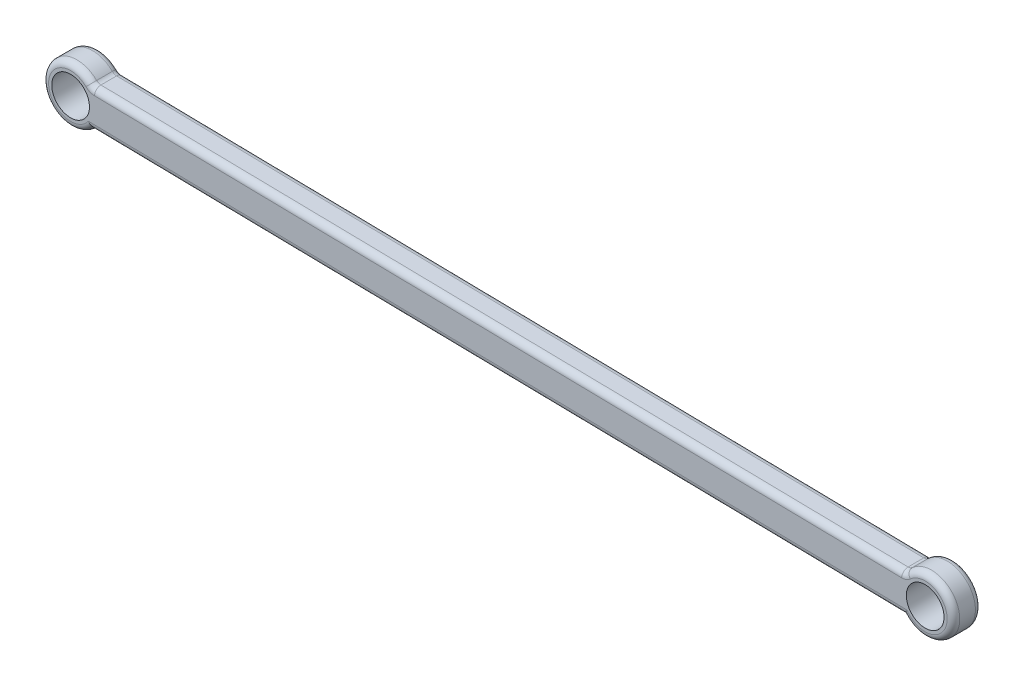
ISO-10303-21;
HEADER;
FILE_DESCRIPTION(('STEP AP214'),'2;1');
FILE_NAME('part.step','',(''),(''),'','','');
FILE_SCHEMA(('AUTOMOTIVE_DESIGN { 1 0 10303 214 1 1 1 1 }'));
ENDSEC;
DATA;
#1=APPLICATION_CONTEXT('core data for automotive mechanical design processes');
#2=APPLICATION_PROTOCOL_DEFINITION('international standard','automotive_design',2000,#1);
#3=PRODUCT_CONTEXT('',#1,'mechanical');
#4=PRODUCT('Part','Part','',(#3));
#5=PRODUCT_RELATED_PRODUCT_CATEGORY('part','',(#4));
#6=PRODUCT_DEFINITION_FORMATION('','',#4);
#7=PRODUCT_DEFINITION_CONTEXT('part definition',#1,'design');
#8=PRODUCT_DEFINITION('design','',#6,#7);
#9=PRODUCT_DEFINITION_SHAPE('','',#8);
#10=(LENGTH_UNIT() NAMED_UNIT(*) SI_UNIT(.MILLI.,.METRE.));
#11=(NAMED_UNIT(*) PLANE_ANGLE_UNIT() SI_UNIT($,.RADIAN.));
#12=(NAMED_UNIT(*) SI_UNIT($,.STERADIAN.) SOLID_ANGLE_UNIT());
#13=UNCERTAINTY_MEASURE_WITH_UNIT(LENGTH_MEASURE(1.E-05),#10,'distance_accuracy_value','');
#14=(GEOMETRIC_REPRESENTATION_CONTEXT(3) GLOBAL_UNCERTAINTY_ASSIGNED_CONTEXT((#13)) GLOBAL_UNIT_ASSIGNED_CONTEXT((#10,
#11,#12)) REPRESENTATION_CONTEXT('',''));
#15=CARTESIAN_POINT('',(0.,0.,0.));
#16=DIRECTION('',(0.,0.,1.));
#17=DIRECTION('',(1.,0.,0.));
#18=AXIS2_PLACEMENT_3D('',#15,#16,#17);
#19=CARTESIAN_POINT('',(0.,0.,0.));
#20=DIRECTION('',(0.,0.,1.));
#21=DIRECTION('',(1.,0.,0.));
#22=AXIS2_PLACEMENT_3D('',#19,#20,#21);
#23=PLANE('',#22);
#24=CARTESIAN_POINT('',(0.,0.,0.));
#25=DIRECTION('',(0.,0.,1.));
#26=DIRECTION('',(1.,0.,0.));
#27=AXIS2_PLACEMENT_3D('',#24,#25,#26);
#28=CIRCLE('',#27,3.);
#29=CARTESIAN_POINT('',(3.,0.,0.));
#30=VERTEX_POINT('',#29);
#31=EDGE_CURVE('E327',#30,#30,#28,.T.);
#32=ORIENTED_EDGE('',*,*,#31,.T.);
#33=EDGE_LOOP('',(#32));
#34=FACE_BOUND('',#33,.T.);
#35=CARTESIAN_POINT('',(135.979972583347,-2.33389293503487,0.));
#36=DIRECTION('',(0.,0.,1.));
#37=DIRECTION('',(1.,0.,0.));
#38=AXIS2_PLACEMENT_3D('',#35,#36,#37);
#39=CIRCLE('',#38,2.99999999999999);
#40=CARTESIAN_POINT('',(138.979972583347,-2.33389293503487,0.));
#41=VERTEX_POINT('',#40);
#42=EDGE_CURVE('E326',#41,#41,#39,.T.);
#43=ORIENTED_EDGE('',*,*,#42,.T.);
#44=EDGE_LOOP('',(#43));
#45=FACE_BOUND('',#44,.T.);
#46=CARTESIAN_POINT('',(3.84300523160737,3.93462968903535,0.));
#47=DIRECTION('',(0.,0.,1.));
#48=DIRECTION('',(1.,0.,0.));
#49=AXIS2_PLACEMENT_3D('',#46,#47,#48);
#50=CIRCLE('',#49,2.);
#51=CARTESIAN_POINT('',(3.80868327668039,1.93492420986848,0.));
#52=VERTEX_POINT('',#51);
#53=CARTESIAN_POINT('',(2.44554878375015,2.50385525665886,0.));
#54=VERTEX_POINT('',#53);
#55=EDGE_CURVE('E185',#52,#54,#50,.F.);
#56=ORIENTED_EDGE('',*,*,#55,.F.);
#57=DIRECTION('',(0.999852739583434,-0.0171609774634917,0.));
#58=VECTOR('',#57,1.);
#59=CARTESIAN_POINT('',(132.660686498477,-0.276627787614941,0.));
#60=LINE('',#59,#58);
#61=CARTESIAN_POINT('',(132.239933216521,-0.269406186569618,0.));
#62=VERTEX_POINT('',#61);
#63=EDGE_CURVE('E183',#52,#62,#60,.T.);
#64=ORIENTED_EDGE('',*,*,#63,.T.);
#65=CARTESIAN_POINT('',(132.274255171448,1.73029929259725,0.));
#66=DIRECTION('',(0.,0.,1.));
#67=DIRECTION('',(1.,0.,0.));
#68=AXIS2_PLACEMENT_3D('',#65,#66,#67);
#69=CIRCLE('',#68,2.);
#70=CARTESIAN_POINT('',(133.621788775775,0.252411209821921,0.));
#71=VERTEX_POINT('',#70);
#72=EDGE_CURVE('E180',#71,#62,#69,.F.);
#73=ORIENTED_EDGE('',*,*,#72,.F.);
#74=CARTESIAN_POINT('',(135.979972583347,-2.33389293503487,0.));
#75=DIRECTION('',(0.,0.,1.));
#76=DIRECTION('',(1.,0.,0.));
#77=AXIS2_PLACEMENT_3D('',#74,#75,#76);
#78=CIRCLE('',#77,3.5);
#79=CARTESIAN_POINT('',(133.073792278495,-4.28430725914431,0.));
#80=VERTEX_POINT('',#79);
#81=EDGE_CURVE('E177',#71,#80,#78,.F.);
#82=ORIENTED_EDGE('',*,*,#81,.T.);
#83=DIRECTION('',(0.999852739583434,-0.0171609774634917,0.));
#84=VECTOR('',#83,1.);
#85=CARTESIAN_POINT('',(-0.0343219549269834,-1.99970547916687,0.));
#86=LINE('',#85,#84);
#87=CARTESIAN_POINT('',(2.83753639499787,-2.04899663422429,0.));
#88=VERTEX_POINT('',#87);
#89=EDGE_CURVE('E173',#80,#88,#86,.F.);
#90=ORIENTED_EDGE('',*,*,#89,.T.);
#91=CARTESIAN_POINT('',(0.,0.,0.));
#92=DIRECTION('',(0.,0.,1.));
#93=DIRECTION('',(1.,0.,0.));
#94=AXIS2_PLACEMENT_3D('',#91,#92,#93);
#95=CIRCLE('',#94,3.5);
#96=EDGE_CURVE('E175',#88,#54,#95,.F.);
#97=ORIENTED_EDGE('',*,*,#96,.T.);
#98=EDGE_LOOP('',(#56,#64,#73,#82,#90,#97));
#99=FACE_BOUND('',#98,.T.);
#100=ADVANCED_FACE('F36',(#34,#45,#99),#23,.F.);
#101=CARTESIAN_POINT('',(0.,0.,4.5));
#102=DIRECTION('',(0.,0.,1.));
#103=DIRECTION('',(1.,0.,0.));
#104=AXIS2_PLACEMENT_3D('',#101,#102,#103);
#105=PLANE('',#104);
#106=CARTESIAN_POINT('',(0.,0.,4.5));
#107=DIRECTION('',(0.,0.,1.));
#108=DIRECTION('',(1.,0.,0.));
#109=AXIS2_PLACEMENT_3D('',#106,#107,#108);
#110=CIRCLE('',#109,3.);
#111=CARTESIAN_POINT('',(3.,0.,4.5));
#112=VERTEX_POINT('',#111);
#113=EDGE_CURVE('E332',#112,#112,#110,.T.);
#114=ORIENTED_EDGE('',*,*,#113,.F.);
#115=EDGE_LOOP('',(#114));
#116=FACE_BOUND('',#115,.T.);
#117=CARTESIAN_POINT('',(135.979972583347,-2.33389293503487,4.5));
#118=DIRECTION('',(0.,0.,1.));
#119=DIRECTION('',(1.,0.,0.));
#120=AXIS2_PLACEMENT_3D('',#117,#118,#119);
#121=CIRCLE('',#120,2.99999999999999);
#122=CARTESIAN_POINT('',(138.979972583347,-2.33389293503487,4.5));
#123=VERTEX_POINT('',#122);
#124=EDGE_CURVE('E323',#123,#123,#121,.T.);
#125=ORIENTED_EDGE('',*,*,#124,.F.);
#126=EDGE_LOOP('',(#125));
#127=FACE_BOUND('',#126,.T.);
#128=CARTESIAN_POINT('',(132.274255171448,1.73029929259725,4.5));
#129=DIRECTION('',(0.,0.,1.));
#130=DIRECTION('',(1.,0.,0.));
#131=AXIS2_PLACEMENT_3D('',#128,#129,#130);
#132=CIRCLE('',#131,2.);
#133=CARTESIAN_POINT('',(132.239933216521,-0.269406186569618,4.5));
#134=VERTEX_POINT('',#133);
#135=CARTESIAN_POINT('',(133.621788775775,0.252411209821921,4.5));
#136=VERTEX_POINT('',#135);
#137=EDGE_CURVE('E163',#134,#136,#132,.T.);
#138=ORIENTED_EDGE('',*,*,#137,.F.);
#139=DIRECTION('',(0.999852739583434,-0.0171609774634917,0.));
#140=VECTOR('',#139,1.);
#141=CARTESIAN_POINT('',(0.0343219549269834,1.99970547916687,4.5));
#142=LINE('',#141,#140);
#143=CARTESIAN_POINT('',(3.80868327668039,1.93492420986848,4.5));
#144=VERTEX_POINT('',#143);
#145=EDGE_CURVE('E161',#134,#144,#142,.F.);
#146=ORIENTED_EDGE('',*,*,#145,.T.);
#147=CARTESIAN_POINT('',(3.84300523160737,3.93462968903535,4.5));
#148=DIRECTION('',(0.,0.,1.));
#149=DIRECTION('',(1.,0.,0.));
#150=AXIS2_PLACEMENT_3D('',#147,#148,#149);
#151=CIRCLE('',#150,2.);
#152=CARTESIAN_POINT('',(2.44554878375015,2.50385525665886,4.5));
#153=VERTEX_POINT('',#152);
#154=EDGE_CURVE('E133',#153,#144,#151,.T.);
#155=ORIENTED_EDGE('',*,*,#154,.F.);
#156=CARTESIAN_POINT('',(0.,0.,4.5));
#157=DIRECTION('',(0.,0.,1.));
#158=DIRECTION('',(1.,0.,0.));
#159=AXIS2_PLACEMENT_3D('',#156,#157,#158);
#160=CIRCLE('',#159,3.5);
#161=CARTESIAN_POINT('',(2.83753639499787,-2.04899663422429,4.5));
#162=VERTEX_POINT('',#161);
#163=EDGE_CURVE('E125',#153,#162,#160,.T.);
#164=ORIENTED_EDGE('',*,*,#163,.T.);
#165=DIRECTION('',(0.999852739583434,-0.0171609774634917,0.));
#166=VECTOR('',#165,1.);
#167=CARTESIAN_POINT('',(132.592042588623,-4.27603874594867,4.5));
#168=LINE('',#167,#166);
#169=CARTESIAN_POINT('',(133.073792278495,-4.28430725914431,4.5));
#170=VERTEX_POINT('',#169);
#171=EDGE_CURVE('E130',#162,#170,#168,.T.);
#172=ORIENTED_EDGE('',*,*,#171,.T.);
#173=CARTESIAN_POINT('',(135.979972583347,-2.33389293503487,4.5));
#174=DIRECTION('',(0.,0.,1.));
#175=DIRECTION('',(1.,0.,0.));
#176=AXIS2_PLACEMENT_3D('',#173,#174,#175);
#177=CIRCLE('',#176,3.5);
#178=EDGE_CURVE('E137',#170,#136,#177,.T.);
#179=ORIENTED_EDGE('',*,*,#178,.T.);
#180=EDGE_LOOP('',(#138,#146,#155,#164,#172,#179));
#181=FACE_BOUND('',#180,.T.);
#182=ADVANCED_FACE('F127',(#116,#127,#181),#105,.T.);
#183=CARTESIAN_POINT('',(-0.0514829323904751,-2.9995582187503,4.5));
#184=DIRECTION('',(0.0171609774634917,0.999852739583434,0.));
#185=DIRECTION('',(-0.999852739583434,0.0171609774634917,0.));
#186=AXIS2_PLACEMENT_3D('',#183,#184,#185);
#187=PLANE('',#186);
#188=DIRECTION('',(0.,0.,-1.));
#189=VECTOR('',#188,1.);
#190=CARTESIAN_POINT('',(3.30212510740645,-3.05711788700336,4.5));
#191=LINE('',#190,#189);
#192=CARTESIAN_POINT('',(3.30212510740645,-3.05711788700336,3.5));
#193=VERTEX_POINT('',#192);
#194=CARTESIAN_POINT('',(3.30212510740645,-3.05711788700336,1.));
#195=VERTEX_POINT('',#194);
#196=EDGE_CURVE('E155',#193,#195,#191,.T.);
#197=ORIENTED_EDGE('',*,*,#196,.T.);
#198=DIRECTION('',(0.999852739583434,-0.0171609774634917,0.));
#199=VECTOR('',#198,1.);
#200=CARTESIAN_POINT('',(-0.0514829323904751,-2.9995582187503,1.));
#201=LINE('',#200,#199);
#202=CARTESIAN_POINT('',(132.57488161116,-5.27589148553211,1.));
#203=VERTEX_POINT('',#202);
#204=EDGE_CURVE('E11',#195,#203,#201,.T.);
#205=ORIENTED_EDGE('',*,*,#204,.T.);
#206=DIRECTION('',(0.,0.,-1.));
#207=VECTOR('',#206,1.);
#208=CARTESIAN_POINT('',(132.57488161116,-5.27589148553211,4.5));
#209=LINE('',#208,#207);
#210=CARTESIAN_POINT('',(132.57488161116,-5.27589148553211,3.5));
#211=VERTEX_POINT('',#210);
#212=EDGE_CURVE('E152',#211,#203,#209,.T.);
#213=ORIENTED_EDGE('',*,*,#212,.F.);
#214=DIRECTION('',(0.999852739583434,-0.0171609774634917,0.));
#215=VECTOR('',#214,1.);
#216=CARTESIAN_POINT('',(3.30212510740645,-3.05711788700336,3.5));
#217=LINE('',#216,#215);
#218=EDGE_CURVE('E45',#211,#193,#217,.F.);
#219=ORIENTED_EDGE('',*,*,#218,.T.);
#220=EDGE_LOOP('',(#197,#205,#213,#219));
#221=FACE_BOUND('',#220,.T.);
#222=ADVANCED_FACE('F293',(#221),#187,.F.);
#223=CARTESIAN_POINT('',(135.979972583347,-2.33389293503487,4.5));
#224=DIRECTION('',(0.,0.,-1.));
#225=DIRECTION('',(-1.,0.,0.));
#226=AXIS2_PLACEMENT_3D('',#223,#224,#225);
#227=CYLINDRICAL_SURFACE('',#226,4.5);
#228=DIRECTION('',(0.,0.,-1.));
#229=VECTOR('',#228,1.);
#230=CARTESIAN_POINT('',(132.948021973611,0.991355251209587,4.5));
#231=LINE('',#230,#229);
#232=CARTESIAN_POINT('',(132.948021973611,0.991355251209587,1.));
#233=VERTEX_POINT('',#232);
#234=CARTESIAN_POINT('',(132.948021973611,0.991355251209587,3.5));
#235=VERTEX_POINT('',#234);
#236=EDGE_CURVE('E166',#233,#235,#231,.F.);
#237=ORIENTED_EDGE('',*,*,#236,.T.);
#238=CARTESIAN_POINT('',(135.979972583347,-2.33389293503487,3.5));
#239=DIRECTION('',(0.,0.,1.));
#240=DIRECTION('',(1.,0.,0.));
#241=AXIS2_PLACEMENT_3D('',#238,#239,#240);
#242=CIRCLE('',#241,4.5);
#243=EDGE_CURVE('E170',#235,#211,#242,.F.);
#244=ORIENTED_EDGE('',*,*,#243,.T.);
#245=ORIENTED_EDGE('',*,*,#212,.T.);
#246=CARTESIAN_POINT('',(135.979972583347,-2.33389293503487,1.));
#247=DIRECTION('',(0.,0.,1.));
#248=DIRECTION('',(1.,0.,0.));
#249=AXIS2_PLACEMENT_3D('',#246,#247,#248);
#250=CIRCLE('',#249,4.5);
#251=EDGE_CURVE('E168',#203,#233,#250,.T.);
#252=ORIENTED_EDGE('',*,*,#251,.T.);
#253=EDGE_LOOP('',(#237,#244,#245,#252));
#254=FACE_BOUND('',#253,.T.);
#255=ADVANCED_FACE('F307',(#254),#227,.T.);
#256=CARTESIAN_POINT('',(0.0514829323904751,2.9995582187503,4.5));
#257=DIRECTION('',(0.0171609774634917,0.999852739583434,0.));
#258=DIRECTION('',(-0.999852739583434,0.0171609774634917,0.));
#259=AXIS2_PLACEMENT_3D('',#256,#257,#258);
#260=PLANE('',#259);
#261=DIRECTION('',(0.999852739583434,-0.0171609774634917,0.));
#262=VECTOR('',#261,1.);
#263=CARTESIAN_POINT('',(0.0514829323904751,2.9995582187503,3.5));
#264=LINE('',#263,#262);
#265=CARTESIAN_POINT('',(3.82584425414388,2.93477694945191,3.5));
#266=VERTEX_POINT('',#265);
#267=CARTESIAN_POINT('',(132.257094193984,0.730446553013816,3.5));
#268=VERTEX_POINT('',#267);
#269=EDGE_CURVE('E53',#266,#268,#264,.T.);
#270=ORIENTED_EDGE('',*,*,#269,.T.);
#271=DIRECTION('',(0.,0.,-1.));
#272=VECTOR('',#271,1.);
#273=CARTESIAN_POINT('',(132.257094193984,0.730446553013816,4.5));
#274=LINE('',#273,#272);
#275=CARTESIAN_POINT('',(132.257094193984,0.730446553013816,1.));
#276=VERTEX_POINT('',#275);
#277=EDGE_CURVE('E197',#268,#276,#274,.T.);
#278=ORIENTED_EDGE('',*,*,#277,.T.);
#279=DIRECTION('',(0.999852739583434,-0.0171609774634917,0.));
#280=VECTOR('',#279,1.);
#281=CARTESIAN_POINT('',(3.4050909721874,2.94199855049724,1.));
#282=LINE('',#281,#280);
#283=CARTESIAN_POINT('',(3.82584425414388,2.93477694945191,1.));
#284=VERTEX_POINT('',#283);
#285=EDGE_CURVE('E193',#276,#284,#282,.F.);
#286=ORIENTED_EDGE('',*,*,#285,.T.);
#287=DIRECTION('',(0.,0.,-1.));
#288=VECTOR('',#287,1.);
#289=CARTESIAN_POINT('',(3.82584425414388,2.93477694945191,4.5));
#290=LINE('',#289,#288);
#291=EDGE_CURVE('E58',#284,#266,#290,.F.);
#292=ORIENTED_EDGE('',*,*,#291,.T.);
#293=EDGE_LOOP('',(#270,#278,#286,#292));
#294=FACE_BOUND('',#293,.T.);
#295=ADVANCED_FACE('F303',(#294),#260,.T.);
#296=CARTESIAN_POINT('',(0.,0.,4.5));
#297=DIRECTION('',(0.,0.,-1.));
#298=DIRECTION('',(-1.,0.,0.));
#299=AXIS2_PLACEMENT_3D('',#296,#297,#298);
#300=CYLINDRICAL_SURFACE('',#299,3.);
#301=ORIENTED_EDGE('',*,*,#113,.T.);
#302=EDGE_LOOP('',(#301));
#303=FACE_BOUND('',#302,.T.);
#304=ORIENTED_EDGE('',*,*,#31,.F.);
#305=EDGE_LOOP('',(#304));
#306=FACE_BOUND('',#305,.T.);
#307=ADVANCED_FACE('F306',(#303,#306),#300,.F.);
#308=CARTESIAN_POINT('',(135.979972583347,-2.33389293503487,4.5));
#309=DIRECTION('',(0.,0.,-1.));
#310=DIRECTION('',(-1.,0.,0.));
#311=AXIS2_PLACEMENT_3D('',#308,#309,#310);
#312=CYLINDRICAL_SURFACE('',#311,2.99999999999999);
#313=ORIENTED_EDGE('',*,*,#124,.T.);
#314=EDGE_LOOP('',(#313));
#315=FACE_BOUND('',#314,.T.);
#316=ORIENTED_EDGE('',*,*,#42,.F.);
#317=EDGE_LOOP('',(#316));
#318=FACE_BOUND('',#317,.T.);
#319=ADVANCED_FACE('F301',(#315,#318),#312,.F.);
#320=CARTESIAN_POINT('',(0.,0.,4.5));
#321=DIRECTION('',(0.,0.,-1.));
#322=DIRECTION('',(-1.,0.,0.));
#323=AXIS2_PLACEMENT_3D('',#320,#321,#322);
#324=CYLINDRICAL_SURFACE('',#323,4.5);
#325=ORIENTED_EDGE('',*,*,#196,.F.);
#326=CARTESIAN_POINT('',(0.,0.,3.5));
#327=DIRECTION('',(0.,0.,1.));
#328=DIRECTION('',(1.,0.,0.));
#329=AXIS2_PLACEMENT_3D('',#326,#327,#328);
#330=CIRCLE('',#329,4.5);
#331=CARTESIAN_POINT('',(3.14427700767876,3.2192424728471,3.5));
#332=VERTEX_POINT('',#331);
#333=EDGE_CURVE('E143',#193,#332,#330,.F.);
#334=ORIENTED_EDGE('',*,*,#333,.T.);
#335=DIRECTION('',(0.,0.,-1.));
#336=VECTOR('',#335,1.);
#337=CARTESIAN_POINT('',(3.14427700767876,3.2192424728471,4.5));
#338=LINE('',#337,#336);
#339=CARTESIAN_POINT('',(3.14427700767876,3.2192424728471,1.));
#340=VERTEX_POINT('',#339);
#341=EDGE_CURVE('E188',#332,#340,#338,.T.);
#342=ORIENTED_EDGE('',*,*,#341,.T.);
#343=CARTESIAN_POINT('',(0.,0.,1.));
#344=DIRECTION('',(0.,0.,1.));
#345=DIRECTION('',(1.,0.,0.));
#346=AXIS2_PLACEMENT_3D('',#343,#344,#345);
#347=CIRCLE('',#346,4.5);
#348=EDGE_CURVE('E190',#340,#195,#347,.T.);
#349=ORIENTED_EDGE('',*,*,#348,.T.);
#350=EDGE_LOOP('',(#325,#334,#342,#349));
#351=FACE_BOUND('',#350,.T.);
#352=ADVANCED_FACE('F275',(#351),#324,.T.);
#353=CARTESIAN_POINT('',(0.,0.,1.));
#354=DIRECTION('',(0.,0.,1.));
#355=DIRECTION('',(1.,0.,0.));
#356=AXIS2_PLACEMENT_3D('',#353,#354,#355);
#357=TOROIDAL_SURFACE('',#356,3.5,1.);
#358=CARTESIAN_POINT('',(2.44554878375015,2.50385525665886,1.));
#359=DIRECTION('',(0.715387216188245,-0.698728223928613,0.));
#360=DIRECTION('',(0.698728223928613,0.715387216188245,0.));
#361=AXIS2_PLACEMENT_3D('',#358,#359,#360);
#362=CIRCLE('',#361,1.);
#363=EDGE_CURVE('E40',#54,#340,#362,.T.);
#364=ORIENTED_EDGE('',*,*,#363,.F.);
#365=ORIENTED_EDGE('',*,*,#96,.F.);
#366=CARTESIAN_POINT('',(3.30212510740645,-3.05711788700336,1.));
#367=CARTESIAN_POINT('',(3.30212521157756,-3.05711885999082,0.97369098490513));
#368=CARTESIAN_POINT('',(3.30167838618239,-3.05607106920634,0.94739518986789));
#369=CARTESIAN_POINT('',(3.29989710890886,-3.05189875249214,0.895004564383917));
#370=CARTESIAN_POINT('',(3.29856284161664,-3.04877465842942,0.868909693286948));
#371=CARTESIAN_POINT('',(3.29325125856682,-3.0363495891277,0.791366107169315));
#372=CARTESIAN_POINT('',(3.28796504552772,-3.02399546763632,0.740458545465482));
#373=CARTESIAN_POINT('',(3.27407319459768,-2.99166496737962,0.641663046184638));
#374=CARTESIAN_POINT('',(3.26546852490816,-2.97169081187325,0.593774232587049));
#375=CARTESIAN_POINT('',(3.24519847405663,-2.92490584486608,0.502152826212401));
#376=CARTESIAN_POINT('',(3.23353187051052,-2.89809230306849,0.458421902866517));
#377=CARTESIAN_POINT('',(3.2070372870186,-2.83763133304747,0.374752658797062));
#378=CARTESIAN_POINT('',(3.19211914646959,-2.8037906788811,0.334983067917316));
#379=CARTESIAN_POINT('',(3.15975010332598,-2.731001518731,0.261645150064272));
#380=CARTESIAN_POINT('',(3.14229850400742,-2.69205160794069,0.228078534755707));
#381=CARTESIAN_POINT('',(3.10373998606094,-2.6068442228663,0.165151698384092));
#382=CARTESIAN_POINT('',(3.08245079715035,-2.56024956871209,0.136360623747813));
#383=CARTESIAN_POINT('',(3.03785182167322,-2.46380524603787,0.0869139036327585));
#384=CARTESIAN_POINT('',(3.01454074282351,-2.41395350085728,0.0662635086864707));
#385=CARTESIAN_POINT('',(2.96667554118471,-2.31292208958825,0.0334198829886458));
#386=CARTESIAN_POINT('',(2.94213941234964,-2.26176514636932,0.0211293768558328));
#387=CARTESIAN_POINT('',(2.89204507406303,-2.15875214580948,0.00459543830027396));
#388=CARTESIAN_POINT('',(2.86648894561666,-2.10689764196446,0.000336399113860563));
#389=CARTESIAN_POINT('',(2.83961930142509,-2.05315879062629,6.36962392184466E-06));
#390=CARTESIAN_POINT('',(2.83857806109978,-2.0510775328194,-1.35553738185482E-08));
#391=CARTESIAN_POINT('',(2.83753639499787,-2.04899663422429,0.));
#392=B_SPLINE_CURVE_WITH_KNOTS('',3,(#366,#367,#368,#369,#370,#371,#372,#373,#374,#375,#376,
#377,#378,#379,#380,#381,#382,#383,#384,#385,#386,#387,#388,#389,#390,#391),.UNSPECIFIED.,.F.,
.F.,(4,2,2,2,2,2,2,2,2,2,2,2,4),(0.,0.0788764496467869,0.157736498278996,0.314864929107357,
0.471947550383108,0.629092977767609,0.791328554360695,0.953608832017077,1.12917135093585,
1.30484691869941,1.47844166216896,1.65169872695729,1.65868028216447),.UNSPECIFIED.);
#393=EDGE_CURVE('E263',#195,#88,#392,.T.);
#394=ORIENTED_EDGE('',*,*,#393,.F.);
#395=ORIENTED_EDGE('',*,*,#348,.F.);
#396=EDGE_LOOP('',(#364,#365,#394,#395));
#397=FACE_BOUND('',#396,.T.);
#398=ADVANCED_FACE('F271',(#397),#357,.T.);
#399=CARTESIAN_POINT('',(3.84300523160737,3.93462968903535,1.));
#400=DIRECTION('',(0.,0.,1.));
#401=DIRECTION('',(1.,0.,0.));
#402=AXIS2_PLACEMENT_3D('',#399,#400,#401);
#403=TOROIDAL_SURFACE('',#402,2.,1.);
#404=ORIENTED_EDGE('',*,*,#55,.T.);
#405=ORIENTED_EDGE('',*,*,#363,.T.);
#406=CARTESIAN_POINT('',(3.84300523160737,3.93462968903535,1.));
#407=DIRECTION('',(0.,0.,1.));
#408=DIRECTION('',(1.,0.,0.));
#409=AXIS2_PLACEMENT_3D('',#406,#407,#408);
#410=CIRCLE('',#409,1.);
#411=EDGE_CURVE('E270',#284,#340,#410,.F.);
#412=ORIENTED_EDGE('',*,*,#411,.F.);
#413=CARTESIAN_POINT('',(3.80868327668039,1.93492420986848,1.));
#414=DIRECTION('',(-0.999852739583434,0.0171609774634917,0.));
#415=DIRECTION('',(-0.0171609774634917,-0.999852739583434,0.));
#416=AXIS2_PLACEMENT_3D('',#413,#414,#415);
#417=CIRCLE('',#416,1.);
#418=EDGE_CURVE('E351',#52,#284,#417,.F.);
#419=ORIENTED_EDGE('',*,*,#418,.F.);
#420=EDGE_LOOP('',(#404,#405,#412,#419));
#421=FACE_BOUND('',#420,.T.);
#422=ADVANCED_FACE('F38',(#421),#403,.T.);
#423=CARTESIAN_POINT('',(-0.0343219549269834,-1.99970547916687,1.));
#424=DIRECTION('',(0.999852739583434,-0.0171609774634917,0.));
#425=DIRECTION('',(0.0171609774634917,0.999852739583434,0.));
#426=AXIS2_PLACEMENT_3D('',#423,#424,#425);
#427=CYLINDRICAL_SURFACE('',#426,1.);
#428=ORIENTED_EDGE('',*,*,#393,.T.);
#429=ORIENTED_EDGE('',*,*,#89,.F.);
#430=CARTESIAN_POINT('',(132.57488161116,-5.27589148553211,1.));
#431=CARTESIAN_POINT('',(132.57488147366,-5.27589245437165,0.973690984905129));
#432=CARTESIAN_POINT('',(132.575363992808,-5.27486061439685,0.947395189867889));
#433=CARTESIAN_POINT('',(132.57728740189,-5.27075188308533,0.895004564383915));
#434=CARTESIAN_POINT('',(132.578728092527,-5.26767541702681,0.868909693286946));
#435=CARTESIAN_POINT('',(132.584462936932,-5.25543994313759,0.791366107169313));
#436=CARTESIAN_POINT('',(132.590169991561,-5.24327450465045,0.740458545465481));
#437=CARTESIAN_POINT('',(132.60516314278,-5.21143977227165,0.641663046184636));
#438=CARTESIAN_POINT('',(132.614448195444,-5.19177266710378,0.593774232587046));
#439=CARTESIAN_POINT('',(132.636311822336,-5.14571086168388,0.502152826212397));
#440=CARTESIAN_POINT('',(132.648891711923,-5.11931347469165,0.458421902866515));
#441=CARTESIAN_POINT('',(132.677445523252,-5.05979732806865,0.37475265879706));
#442=CARTESIAN_POINT('',(132.693516183409,-5.02648855033716,0.334983067917312));
#443=CARTESIAN_POINT('',(132.72836405962,-4.95485306811635,0.261645150064267));
#444=CARTESIAN_POINT('',(132.747142020195,-4.91652498355728,0.228078534755705));
#445=CARTESIAN_POINT('',(132.78860188061,-4.83269099431746,0.165151698384092));
#446=CARTESIAN_POINT('',(132.811477514342,-4.78685436331611,0.136360623747812));
#447=CARTESIAN_POINT('',(132.859359891339,-4.69199734479457,0.0869139036327576));
#448=CARTESIAN_POINT('',(132.884367997391,-4.64297492618408,0.0662635086864702));
#449=CARTESIAN_POINT('',(132.935672091411,-4.54364560761384,0.0334198829886483));
#450=CARTESIAN_POINT('',(132.961949316247,-4.49336079964313,0.0211293768558368));
#451=CARTESIAN_POINT('',(133.015549235961,-4.39212755599563,0.00459543830027741));
#452=CARTESIAN_POINT('',(133.042869797748,-4.34118060148608,0.000336399113862785));
#453=CARTESIAN_POINT('',(133.071567766588,-4.28839548515035,6.36962392197958E-06));
#454=CARTESIAN_POINT('',(133.072679815942,-4.28635118534157,-1.35553737645666E-08));
#455=CARTESIAN_POINT('',(133.073792278495,-4.28430725914433,0.));
#456=B_SPLINE_CURVE_WITH_KNOTS('',3,(#430,#431,#432,#433,#434,#435,#436,#437,#438,#439,#440,
#441,#442,#443,#444,#445,#446,#447,#448,#449,#450,#451,#452,#453,#454,#455),.UNSPECIFIED.,.F.,
.F.,(4,2,2,2,2,2,2,2,2,2,2,2,4),(0.,0.0788764496467885,0.157736498278998,0.314864929107358,
0.471947550383107,0.629092977767616,0.7913285543607,0.953608832017076,1.12917135093586,
1.30484691869941,1.47844166216893,1.65169872695724,1.65868028216443),.UNSPECIFIED.);
#457=EDGE_CURVE('E256',#203,#80,#456,.T.);
#458=ORIENTED_EDGE('',*,*,#457,.F.);
#459=ORIENTED_EDGE('',*,*,#204,.F.);
#460=EDGE_LOOP('',(#428,#429,#458,#459));
#461=FACE_BOUND('',#460,.T.);
#462=ADVANCED_FACE('F246',(#461),#427,.T.);
#463=CARTESIAN_POINT('',(3.84300523160737,3.93462968903535,4.5));
#464=DIRECTION('',(0.,0.,-1.));
#465=DIRECTION('',(-1.,0.,0.));
#466=AXIS2_PLACEMENT_3D('',#463,#464,#465);
#467=CYLINDRICAL_SURFACE('',#466,1.);
#468=ORIENTED_EDGE('',*,*,#411,.T.);
#469=ORIENTED_EDGE('',*,*,#341,.F.);
#470=CARTESIAN_POINT('',(3.84300523160737,3.93462968903535,3.5));
#471=DIRECTION('',(0.,0.,1.));
#472=DIRECTION('',(1.,0.,0.));
#473=AXIS2_PLACEMENT_3D('',#470,#471,#472);
#474=CIRCLE('',#473,1.);
#475=EDGE_CURVE('E352',#266,#332,#474,.F.);
#476=ORIENTED_EDGE('',*,*,#475,.F.);
#477=ORIENTED_EDGE('',*,*,#291,.F.);
#478=EDGE_LOOP('',(#468,#469,#476,#477));
#479=FACE_BOUND('',#478,.T.);
#480=ADVANCED_FACE('F250',(#479),#467,.F.);
#481=CARTESIAN_POINT('',(0.0343219549269834,1.99970547916687,1.));
#482=DIRECTION('',(-0.999852739583434,0.0171609774634917,0.));
#483=DIRECTION('',(-0.0171609774634917,-0.999852739583434,0.));
#484=AXIS2_PLACEMENT_3D('',#481,#482,#483);
#485=CYLINDRICAL_SURFACE('',#484,1.);
#486=ORIENTED_EDGE('',*,*,#418,.T.);
#487=ORIENTED_EDGE('',*,*,#285,.F.);
#488=CARTESIAN_POINT('',(132.239933216521,-0.269406186569618,1.));
#489=DIRECTION('',(0.999852739583434,-0.0171609774634873,0.));
#490=DIRECTION('',(0.0171609774634873,0.999852739583434,0.));
#491=AXIS2_PLACEMENT_3D('',#488,#489,#490);
#492=CIRCLE('',#491,1.);
#493=EDGE_CURVE('E375',#62,#276,#492,.T.);
#494=ORIENTED_EDGE('',*,*,#493,.F.);
#495=ORIENTED_EDGE('',*,*,#63,.F.);
#496=EDGE_LOOP('',(#486,#487,#494,#495));
#497=FACE_BOUND('',#496,.T.);
#498=ADVANCED_FACE('F278',(#497),#485,.T.);
#499=CARTESIAN_POINT('',(135.979972583347,-2.33389293503487,1.));
#500=DIRECTION('',(0.,0.,1.));
#501=DIRECTION('',(1.,0.,0.));
#502=AXIS2_PLACEMENT_3D('',#499,#500,#501);
#503=TOROIDAL_SURFACE('',#502,3.5,1.);
#504=ORIENTED_EDGE('',*,*,#457,.T.);
#505=ORIENTED_EDGE('',*,*,#81,.F.);
#506=CARTESIAN_POINT('',(133.621788775775,0.252411209821927,1.));
#507=DIRECTION('',(-0.738944041387664,-0.673766802163528,0.));
#508=DIRECTION('',(0.673766802163528,-0.738944041387664,0.));
#509=AXIS2_PLACEMENT_3D('',#506,#507,#508);
#510=CIRCLE('',#509,1.);
#511=EDGE_CURVE('E355',#233,#71,#510,.T.);
#512=ORIENTED_EDGE('',*,*,#511,.F.);
#513=ORIENTED_EDGE('',*,*,#251,.F.);
#514=EDGE_LOOP('',(#504,#505,#512,#513));
#515=FACE_BOUND('',#514,.T.);
#516=ADVANCED_FACE('F244',(#515),#503,.T.);
#517=CARTESIAN_POINT('',(3.84300523160737,3.93462968903535,3.5));
#518=DIRECTION('',(0.,0.,1.));
#519=DIRECTION('',(1.,0.,0.));
#520=AXIS2_PLACEMENT_3D('',#517,#518,#519);
#521=TOROIDAL_SURFACE('',#520,2.,1.);
#522=CARTESIAN_POINT('',(3.80868327668039,1.93492420986848,3.5));
#523=DIRECTION('',(-0.999852739583434,0.0171609774634917,0.));
#524=DIRECTION('',(-0.0171609774634917,-0.999852739583434,0.));
#525=AXIS2_PLACEMENT_3D('',#522,#523,#524);
#526=CIRCLE('',#525,1.);
#527=EDGE_CURVE('E369',#266,#144,#526,.F.);
#528=ORIENTED_EDGE('',*,*,#527,.F.);
#529=ORIENTED_EDGE('',*,*,#475,.T.);
#530=CARTESIAN_POINT('',(2.44554878375015,2.50385525665886,3.5));
#531=DIRECTION('',(0.715387216188245,-0.698728223928613,0.));
#532=DIRECTION('',(0.698728223928613,0.715387216188245,0.));
#533=AXIS2_PLACEMENT_3D('',#530,#531,#532);
#534=CIRCLE('',#533,1.);
#535=EDGE_CURVE('E371',#153,#332,#534,.F.);
#536=ORIENTED_EDGE('',*,*,#535,.F.);
#537=ORIENTED_EDGE('',*,*,#154,.T.);
#538=EDGE_LOOP('',(#528,#529,#536,#537));
#539=FACE_BOUND('',#538,.T.);
#540=ADVANCED_FACE('F240',(#539),#521,.T.);
#541=CARTESIAN_POINT('',(132.274255171448,1.73029929259725,1.));
#542=DIRECTION('',(0.,0.,1.));
#543=DIRECTION('',(1.,0.,0.));
#544=AXIS2_PLACEMENT_3D('',#541,#542,#543);
#545=TOROIDAL_SURFACE('',#544,2.,1.);
#546=ORIENTED_EDGE('',*,*,#72,.T.);
#547=ORIENTED_EDGE('',*,*,#493,.T.);
#548=CARTESIAN_POINT('',(132.274255171448,1.73029929259725,1.));
#549=DIRECTION('',(0.,0.,1.));
#550=DIRECTION('',(1.,0.,0.));
#551=AXIS2_PLACEMENT_3D('',#548,#549,#550);
#552=CIRCLE('',#551,1.);
#553=EDGE_CURVE('E146',#233,#276,#552,.F.);
#554=ORIENTED_EDGE('',*,*,#553,.F.);
#555=ORIENTED_EDGE('',*,*,#511,.T.);
#556=EDGE_LOOP('',(#546,#547,#554,#555));
#557=FACE_BOUND('',#556,.T.);
#558=ADVANCED_FACE('F231',(#557),#545,.T.);
#559=CARTESIAN_POINT('',(0.,0.,3.5));
#560=DIRECTION('',(0.,0.,1.));
#561=DIRECTION('',(1.,0.,0.));
#562=AXIS2_PLACEMENT_3D('',#559,#560,#561);
#563=TOROIDAL_SURFACE('',#562,3.5,1.);
#564=ORIENTED_EDGE('',*,*,#535,.T.);
#565=ORIENTED_EDGE('',*,*,#333,.F.);
#566=CARTESIAN_POINT('',(3.30212510740645,-3.05711788700336,3.5));
#567=CARTESIAN_POINT('',(3.30212521157756,-3.05711885999082,3.52630901509487));
#568=CARTESIAN_POINT('',(3.30167838618239,-3.05607106920634,3.55260481013211));
#569=CARTESIAN_POINT('',(3.29989710890886,-3.05189875249214,3.60499543561608));
#570=CARTESIAN_POINT('',(3.29856284161664,-3.04877465842942,3.63109030671305));
#571=CARTESIAN_POINT('',(3.29325125856682,-3.0363495891277,3.70863389283068));
#572=CARTESIAN_POINT('',(3.28796504552772,-3.02399546763632,3.75954145453452));
#573=CARTESIAN_POINT('',(3.27407319459768,-2.99166496737962,3.85833695381536));
#574=CARTESIAN_POINT('',(3.26546852490816,-2.97169081187325,3.90622576741295));
#575=CARTESIAN_POINT('',(3.24519847405663,-2.92490584486607,3.9978471737876));
#576=CARTESIAN_POINT('',(3.23353187051052,-2.89809230306849,4.04157809713348));
#577=CARTESIAN_POINT('',(3.2070372870186,-2.83763133304747,4.12524734120294));
#578=CARTESIAN_POINT('',(3.19211914646959,-2.8037906788811,4.16501693208268));
#579=CARTESIAN_POINT('',(3.15975010332598,-2.731001518731,4.23835484993573));
#580=CARTESIAN_POINT('',(3.14229850400742,-2.69205160794069,4.27192146524429));
#581=CARTESIAN_POINT('',(3.10373998606094,-2.6068442228663,4.33484830161591));
#582=CARTESIAN_POINT('',(3.08245079715035,-2.56024956871209,4.36363937625219));
#583=CARTESIAN_POINT('',(3.03785182167322,-2.46380524603787,4.41308609636724));
#584=CARTESIAN_POINT('',(3.01454074282351,-2.41395350085728,4.43373649131353));
#585=CARTESIAN_POINT('',(2.96667554118471,-2.31292208958825,4.46658011701135));
#586=CARTESIAN_POINT('',(2.94213941234964,-2.26176514636932,4.47887062314417));
#587=CARTESIAN_POINT('',(2.89204507406303,-2.15875214580948,4.49540456169973));
#588=CARTESIAN_POINT('',(2.86648894561666,-2.10689764196446,4.49966360088614));
#589=CARTESIAN_POINT('',(2.83961930142509,-2.05315879062628,4.49999363037608));
#590=CARTESIAN_POINT('',(2.83857806109978,-2.0510775328194,4.50000001355537));
#591=CARTESIAN_POINT('',(2.83753639499787,-2.04899663422429,4.5));
#592=B_SPLINE_CURVE_WITH_KNOTS('',3,(#566,#567,#568,#569,#570,#571,#572,#573,#574,#575,#576,
#577,#578,#579,#580,#581,#582,#583,#584,#585,#586,#587,#588,#589,#590,#591),.UNSPECIFIED.,.F.,
.F.,(4,2,2,2,2,2,2,2,2,2,2,2,4),(0.,0.0788764496467868,0.157736498278996,0.314864929107357,
0.471947550383108,0.62909297776761,0.791328554360695,0.953608832017076,1.12917135093585,
1.30484691869941,1.47844166216896,1.65169872695729,1.65868028216447),.UNSPECIFIED.);
#593=EDGE_CURVE('E141',#162,#193,#592,.F.);
#594=ORIENTED_EDGE('',*,*,#593,.F.);
#595=ORIENTED_EDGE('',*,*,#163,.F.);
#596=EDGE_LOOP('',(#564,#565,#594,#595));
#597=FACE_BOUND('',#596,.T.);
#598=ADVANCED_FACE('F142',(#597),#563,.T.);
#599=CARTESIAN_POINT('',(0.0343219549269834,1.99970547916687,3.5));
#600=DIRECTION('',(0.999852739583434,-0.0171609774634917,0.));
#601=DIRECTION('',(0.0171609774634917,0.999852739583434,0.));
#602=AXIS2_PLACEMENT_3D('',#599,#600,#601);
#603=CYLINDRICAL_SURFACE('',#602,1.);
#604=ORIENTED_EDGE('',*,*,#527,.T.);
#605=ORIENTED_EDGE('',*,*,#145,.F.);
#606=CARTESIAN_POINT('',(132.239933216521,-0.269406186569618,3.5));
#607=DIRECTION('',(0.999852739583434,-0.0171609774634873,0.));
#608=DIRECTION('',(0.0171609774634873,0.999852739583434,0.));
#609=AXIS2_PLACEMENT_3D('',#606,#607,#608);
#610=CIRCLE('',#609,1.);
#611=EDGE_CURVE('E147',#268,#134,#610,.T.);
#612=ORIENTED_EDGE('',*,*,#611,.F.);
#613=ORIENTED_EDGE('',*,*,#269,.F.);
#614=EDGE_LOOP('',(#604,#605,#612,#613));
#615=FACE_BOUND('',#614,.T.);
#616=ADVANCED_FACE('F230',(#615),#603,.T.);
#617=CARTESIAN_POINT('',(132.274255171448,1.73029929259725,4.5));
#618=DIRECTION('',(0.,0.,-1.));
#619=DIRECTION('',(-1.,0.,0.));
#620=AXIS2_PLACEMENT_3D('',#617,#618,#619);
#621=CYLINDRICAL_SURFACE('',#620,1.);
#622=ORIENTED_EDGE('',*,*,#553,.T.);
#623=ORIENTED_EDGE('',*,*,#277,.F.);
#624=CARTESIAN_POINT('',(132.274255171448,1.73029929259725,3.5));
#625=DIRECTION('',(0.,0.,1.));
#626=DIRECTION('',(1.,0.,0.));
#627=AXIS2_PLACEMENT_3D('',#624,#625,#626);
#628=CIRCLE('',#627,1.);
#629=EDGE_CURVE('E209',#235,#268,#628,.F.);
#630=ORIENTED_EDGE('',*,*,#629,.F.);
#631=ORIENTED_EDGE('',*,*,#236,.F.);
#632=EDGE_LOOP('',(#622,#623,#630,#631));
#633=FACE_BOUND('',#632,.T.);
#634=ADVANCED_FACE('F218',(#633),#621,.F.);
#635=CARTESIAN_POINT('',(-0.0343219549269834,-1.99970547916687,3.5));
#636=DIRECTION('',(-0.999852739583434,0.0171609774634917,0.));
#637=DIRECTION('',(-0.0171609774634917,-0.999852739583434,0.));
#638=AXIS2_PLACEMENT_3D('',#635,#636,#637);
#639=CYLINDRICAL_SURFACE('',#638,1.);
#640=ORIENTED_EDGE('',*,*,#593,.T.);
#641=ORIENTED_EDGE('',*,*,#218,.F.);
#642=CARTESIAN_POINT('',(132.57488161116,-5.27589148553211,3.5));
#643=CARTESIAN_POINT('',(132.57488147366,-5.27589245437165,3.52630901509487));
#644=CARTESIAN_POINT('',(132.575363992808,-5.27486061439685,3.55260481013211));
#645=CARTESIAN_POINT('',(132.57728740189,-5.27075188308533,3.60499543561608));
#646=CARTESIAN_POINT('',(132.578728092527,-5.26767541702681,3.63109030671305));
#647=CARTESIAN_POINT('',(132.584462936932,-5.25543994313759,3.70863389283069));
#648=CARTESIAN_POINT('',(132.590169991561,-5.24327450465045,3.75954145453452));
#649=CARTESIAN_POINT('',(132.60516314278,-5.21143977227165,3.85833695381536));
#650=CARTESIAN_POINT('',(132.614448195444,-5.19177266710378,3.90622576741295));
#651=CARTESIAN_POINT('',(132.636311822336,-5.14571086168388,3.9978471737876));
#652=CARTESIAN_POINT('',(132.648891711923,-5.11931347469165,4.04157809713348));
#653=CARTESIAN_POINT('',(132.677445523252,-5.05979732806865,4.12524734120294));
#654=CARTESIAN_POINT('',(132.693516183409,-5.02648855033716,4.16501693208269));
#655=CARTESIAN_POINT('',(132.72836405962,-4.95485306811635,4.23835484993573));
#656=CARTESIAN_POINT('',(132.747142020195,-4.91652498355728,4.27192146524429));
#657=CARTESIAN_POINT('',(132.78860188061,-4.83269099431746,4.33484830161591));
#658=CARTESIAN_POINT('',(132.811477514342,-4.78685436331611,4.36363937625219));
#659=CARTESIAN_POINT('',(132.859359891339,-4.69199734479457,4.41308609636724));
#660=CARTESIAN_POINT('',(132.884367997391,-4.64297492618408,4.43373649131353));
#661=CARTESIAN_POINT('',(132.935672091411,-4.54364560761384,4.46658011701135));
#662=CARTESIAN_POINT('',(132.961949316247,-4.49336079964313,4.47887062314416));
#663=CARTESIAN_POINT('',(133.015549235961,-4.39212755599563,4.49540456169972));
#664=CARTESIAN_POINT('',(133.042869797748,-4.34118060148608,4.49966360088614));
#665=CARTESIAN_POINT('',(133.071567766588,-4.28839548515035,4.49999363037608));
#666=CARTESIAN_POINT('',(133.072679815942,-4.28635118534157,4.50000001355537));
#667=CARTESIAN_POINT('',(133.073792278495,-4.28430725914433,4.5));
#668=B_SPLINE_CURVE_WITH_KNOTS('',3,(#642,#643,#644,#645,#646,#647,#648,#649,#650,#651,#652,
#653,#654,#655,#656,#657,#658,#659,#660,#661,#662,#663,#664,#665,#666,#667),.UNSPECIFIED.,.F.,
.F.,(4,2,2,2,2,2,2,2,2,2,2,2,4),(0.,0.078876449646788,0.157736498278998,0.314864929107359,
0.471947550383106,0.629092977767616,0.7913285543607,0.953608832017076,1.12917135093586,
1.30484691869941,1.47844166216893,1.65169872695724,1.65868028216443),.UNSPECIFIED.);
#669=EDGE_CURVE('E150',#170,#211,#668,.F.);
#670=ORIENTED_EDGE('',*,*,#669,.F.);
#671=ORIENTED_EDGE('',*,*,#171,.F.);
#672=EDGE_LOOP('',(#640,#641,#670,#671));
#673=FACE_BOUND('',#672,.T.);
#674=ADVANCED_FACE('F149',(#673),#639,.T.);
#675=CARTESIAN_POINT('',(132.274255171448,1.73029929259725,3.5));
#676=DIRECTION('',(0.,0.,1.));
#677=DIRECTION('',(1.,0.,0.));
#678=AXIS2_PLACEMENT_3D('',#675,#676,#677);
#679=TOROIDAL_SURFACE('',#678,2.,1.);
#680=ORIENTED_EDGE('',*,*,#611,.T.);
#681=ORIENTED_EDGE('',*,*,#137,.T.);
#682=CARTESIAN_POINT('',(133.621788775775,0.252411209821921,3.5));
#683=DIRECTION('',(-0.738944041387667,-0.673766802163525,0.));
#684=DIRECTION('',(0.673766802163525,-0.738944041387667,0.));
#685=AXIS2_PLACEMENT_3D('',#682,#683,#684);
#686=CIRCLE('',#685,1.);
#687=EDGE_CURVE('E200',#235,#136,#686,.F.);
#688=ORIENTED_EDGE('',*,*,#687,.F.);
#689=ORIENTED_EDGE('',*,*,#629,.T.);
#690=EDGE_LOOP('',(#680,#681,#688,#689));
#691=FACE_BOUND('',#690,.T.);
#692=ADVANCED_FACE('F217',(#691),#679,.T.);
#693=CARTESIAN_POINT('',(135.979972583347,-2.33389293503487,3.5));
#694=DIRECTION('',(0.,0.,1.));
#695=DIRECTION('',(1.,0.,0.));
#696=AXIS2_PLACEMENT_3D('',#693,#694,#695);
#697=TOROIDAL_SURFACE('',#696,3.5,1.);
#698=ORIENTED_EDGE('',*,*,#669,.T.);
#699=ORIENTED_EDGE('',*,*,#243,.F.);
#700=ORIENTED_EDGE('',*,*,#687,.T.);
#701=ORIENTED_EDGE('',*,*,#178,.F.);
#702=EDGE_LOOP('',(#698,#699,#700,#701));
#703=FACE_BOUND('',#702,.T.);
#704=ADVANCED_FACE('F211',(#703),#697,.T.);
#705=CLOSED_SHELL('',(#100,#182,#222,#255,#295,#307,#319,#352,#398,#422,#462,#480,#498,#516,
#540,#558,#598,#616,#634,#674,#692,#704));
#706=MANIFOLD_SOLID_BREP('B2',#705);
#707=ADVANCED_BREP_SHAPE_REPRESENTATION('',(#18,#706),#14);
#708=SHAPE_DEFINITION_REPRESENTATION(#9,#707);
ENDSEC;
END-ISO-10303-21;
